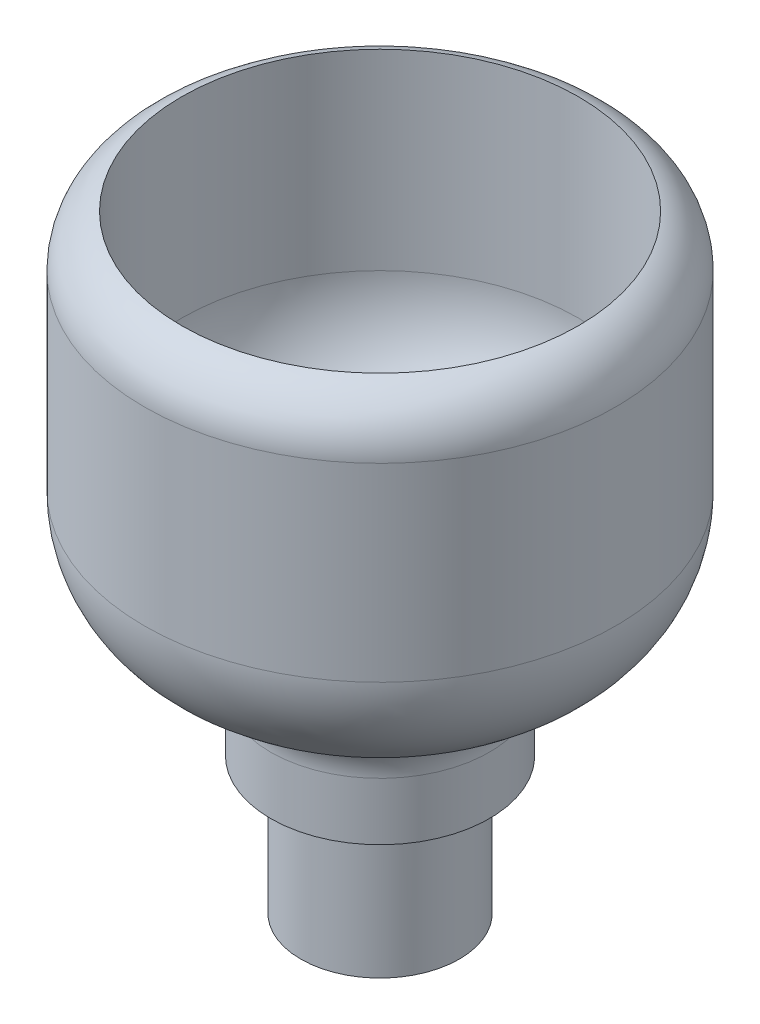
ISO-10303-21;
HEADER;
FILE_DESCRIPTION(('STEP AP214'),'2;1');
FILE_NAME('part.step','',(''),(''),'','','');
FILE_SCHEMA(('AUTOMOTIVE_DESIGN { 1 0 10303 214 1 1 1 1 }'));
ENDSEC;
DATA;
#1=APPLICATION_CONTEXT('core data for automotive mechanical design processes');
#2=APPLICATION_PROTOCOL_DEFINITION('international standard','automotive_design',2000,#1);
#3=PRODUCT_CONTEXT('',#1,'mechanical');
#4=PRODUCT('Part','Part','',(#3));
#5=PRODUCT_RELATED_PRODUCT_CATEGORY('part','',(#4));
#6=PRODUCT_DEFINITION_FORMATION('','',#4);
#7=PRODUCT_DEFINITION_CONTEXT('part definition',#1,'design');
#8=PRODUCT_DEFINITION('design','',#6,#7);
#9=PRODUCT_DEFINITION_SHAPE('','',#8);
#10=(LENGTH_UNIT() NAMED_UNIT(*) SI_UNIT(.MILLI.,.METRE.));
#11=(NAMED_UNIT(*) PLANE_ANGLE_UNIT() SI_UNIT($,.RADIAN.));
#12=(NAMED_UNIT(*) SI_UNIT($,.STERADIAN.) SOLID_ANGLE_UNIT());
#13=UNCERTAINTY_MEASURE_WITH_UNIT(LENGTH_MEASURE(1.E-05),#10,'distance_accuracy_value','');
#14=(GEOMETRIC_REPRESENTATION_CONTEXT(3) GLOBAL_UNCERTAINTY_ASSIGNED_CONTEXT((#13)) GLOBAL_UNIT_ASSIGNED_CONTEXT((#10,
#11,#12)) REPRESENTATION_CONTEXT('',''));
#15=CARTESIAN_POINT('',(0.,0.,0.));
#16=DIRECTION('',(0.,0.,1.));
#17=DIRECTION('',(1.,0.,0.));
#18=AXIS2_PLACEMENT_3D('',#15,#16,#17);
#19=CARTESIAN_POINT('',(2.80000000000001,5.76845965732955,0.));
#20=DIRECTION('',(0.,1.,0.));
#21=DIRECTION('',(0.,0.,1.));
#22=AXIS2_PLACEMENT_3D('',#19,#20,#21);
#23=PLANE('',#22);
#24=CARTESIAN_POINT('',(0.,5.76845965732956,0.));
#25=DIRECTION('',(0.,1.,0.));
#26=DIRECTION('',(0.,0.,1.));
#27=AXIS2_PLACEMENT_3D('',#24,#25,#26);
#28=CIRCLE('',#27,4.00000000000001);
#29=CARTESIAN_POINT('',(0.,5.76845965732956,4.00000000000001));
#30=VERTEX_POINT('',#29);
#31=EDGE_CURVE('E77',#30,#30,#28,.T.);
#32=ORIENTED_EDGE('',*,*,#31,.F.);
#33=EDGE_LOOP('',(#32));
#34=FACE_BOUND('',#33,.T.);
#35=CARTESIAN_POINT('',(0.,5.76845965732955,0.));
#36=DIRECTION('',(0.,1.,0.));
#37=DIRECTION('',(0.,0.,1.));
#38=AXIS2_PLACEMENT_3D('',#35,#36,#37);
#39=CIRCLE('',#38,2.9);
#40=CARTESIAN_POINT('',(0.,5.76845965732955,2.9));
#41=VERTEX_POINT('',#40);
#42=EDGE_CURVE('E10',#41,#41,#39,.F.);
#43=ORIENTED_EDGE('',*,*,#42,.F.);
#44=EDGE_LOOP('',(#43));
#45=FACE_BOUND('',#44,.T.);
#46=ADVANCED_FACE('F49',(#34,#45),#23,.F.);
#47=CARTESIAN_POINT('',(0.,15.9916837741224,0.));
#48=DIRECTION('',(0.,1.,0.));
#49=DIRECTION('',(0.,0.,1.));
#50=AXIS2_PLACEMENT_3D('',#47,#48,#49);
#51=DEGENERATE_TOROIDAL_SURFACE('',#50,2.80000000000001,4.45476445946329,.T.);
#52=CARTESIAN_POINT('',(0.,11.5369193146591,0.));
#53=DIRECTION('',(0.,1.,0.));
#54=DIRECTION('',(0.,0.,1.));
#55=AXIS2_PLACEMENT_3D('',#52,#53,#54);
#56=CIRCLE('',#55,2.80000000000001);
#57=CARTESIAN_POINT('',(0.,11.5369193146591,2.80000000000001));
#58=VERTEX_POINT('',#57);
#59=EDGE_CURVE('E73',#58,#58,#56,.T.);
#60=ORIENTED_EDGE('',*,*,#59,.F.);
#61=EDGE_LOOP('',(#60));
#62=FACE_BOUND('',#61,.T.);
#63=CARTESIAN_POINT('',(0.,15.9916837741224,0.));
#64=DIRECTION('',(0.,1.,0.));
#65=DIRECTION('',(0.,0.,1.));
#66=AXIS2_PLACEMENT_3D('',#63,#64,#65);
#67=CIRCLE('',#66,7.2547644594633);
#68=CARTESIAN_POINT('',(0.,15.9916837741224,7.2547644594633));
#69=VERTEX_POINT('',#68);
#70=EDGE_CURVE('E89',#69,#69,#67,.T.);
#71=ORIENTED_EDGE('',*,*,#70,.T.);
#72=EDGE_LOOP('',(#71));
#73=FACE_BOUND('',#72,.T.);
#74=ADVANCED_FACE('F120',(#62,#73),#51,.F.);
#75=CARTESIAN_POINT('',(0.,81.4290381730289,0.));
#76=DIRECTION('',(0.,1.,0.));
#77=DIRECTION('',(0.,0.,1.));
#78=AXIS2_PLACEMENT_3D('',#75,#76,#77);
#79=CYLINDRICAL_SURFACE('',#78,2.80000000000001);
#80=ORIENTED_EDGE('',*,*,#59,.T.);
#81=EDGE_LOOP('',(#80));
#82=FACE_BOUND('',#81,.T.);
#83=CARTESIAN_POINT('',(0.,0.768459657329554,0.));
#84=DIRECTION('',(0.,-1.,0.));
#85=DIRECTION('',(0.,0.,-1.));
#86=AXIS2_PLACEMENT_3D('',#83,#84,#85);
#87=CIRCLE('',#86,2.80000000000001);
#88=CARTESIAN_POINT('',(0.,0.768459657329554,-2.80000000000001));
#89=VERTEX_POINT('',#88);
#90=EDGE_CURVE('E97',#89,#89,#87,.T.);
#91=ORIENTED_EDGE('',*,*,#90,.T.);
#92=EDGE_LOOP('',(#91));
#93=FACE_BOUND('',#92,.T.);
#94=ADVANCED_FACE('F102',(#82,#93),#79,.F.);
#95=CARTESIAN_POINT('',(0.,81.4290381730289,0.));
#96=DIRECTION('',(0.,1.,0.));
#97=DIRECTION('',(0.,0.,1.));
#98=AXIS2_PLACEMENT_3D('',#95,#96,#97);
#99=CYLINDRICAL_SURFACE('',#98,4.00000000000001);
#100=CARTESIAN_POINT('',(0.,7.87083729987027,0.));
#101=DIRECTION('',(0.,1.,0.));
#102=DIRECTION('',(0.,0.,1.));
#103=AXIS2_PLACEMENT_3D('',#100,#101,#102);
#104=CIRCLE('',#103,4.00000000000001);
#105=CARTESIAN_POINT('',(0.,7.87083729987027,4.00000000000001));
#106=VERTEX_POINT('',#105);
#107=EDGE_CURVE('E57',#106,#106,#104,.F.);
#108=ORIENTED_EDGE('',*,*,#107,.T.);
#109=EDGE_LOOP('',(#108));
#110=FACE_BOUND('',#109,.T.);
#111=ORIENTED_EDGE('',*,*,#31,.T.);
#112=EDGE_LOOP('',(#111));
#113=FACE_BOUND('',#112,.T.);
#114=ADVANCED_FACE('F133',(#110,#113),#99,.T.);
#115=CARTESIAN_POINT('',(0.,14.1752426044835,0.));
#116=DIRECTION('',(0.,1.,0.));
#117=DIRECTION('',(0.,0.,1.));
#118=AXIS2_PLACEMENT_3D('',#115,#116,#117);
#119=DEGENERATE_TOROIDAL_SURFACE('',#118,4.00000000000001,4.614040084913,.T.);
#120=CARTESIAN_POINT('',(0.,9.77720775534845,0.));
#121=DIRECTION('',(0.,1.,0.));
#122=DIRECTION('',(0.,0.,1.));
#123=AXIS2_PLACEMENT_3D('',#120,#121,#122);
#124=CIRCLE('',#123,5.39522592112434);
#125=CARTESIAN_POINT('',(0.,9.77720775534845,5.39522592112434));
#126=VERTEX_POINT('',#125);
#127=EDGE_CURVE('E62',#126,#126,#124,.T.);
#128=ORIENTED_EDGE('',*,*,#127,.T.);
#129=EDGE_LOOP('',(#128));
#130=FACE_BOUND('',#129,.T.);
#131=CARTESIAN_POINT('',(0.,14.1752426044835,0.));
#132=DIRECTION('',(0.,1.,0.));
#133=DIRECTION('',(0.,0.,1.));
#134=AXIS2_PLACEMENT_3D('',#131,#132,#133);
#135=CIRCLE('',#134,8.61404008491301);
#136=CARTESIAN_POINT('',(0.,14.1752426044835,8.61404008491301));
#137=VERTEX_POINT('',#136);
#138=EDGE_CURVE('E81',#137,#137,#135,.T.);
#139=ORIENTED_EDGE('',*,*,#138,.F.);
#140=EDGE_LOOP('',(#139));
#141=FACE_BOUND('',#140,.T.);
#142=ADVANCED_FACE('F153',(#130,#141),#119,.T.);
#143=CARTESIAN_POINT('',(0.,81.4290381730289,0.));
#144=DIRECTION('',(0.,1.,0.));
#145=DIRECTION('',(0.,0.,1.));
#146=AXIS2_PLACEMENT_3D('',#143,#144,#145);
#147=CYLINDRICAL_SURFACE('',#146,8.61404008491301);
#148=CARTESIAN_POINT('',(0.,21.1080356819415,0.));
#149=DIRECTION('',(0.,1.,0.));
#150=DIRECTION('',(0.,0.,1.));
#151=AXIS2_PLACEMENT_3D('',#148,#149,#150);
#152=CIRCLE('',#151,8.61404008491301);
#153=CARTESIAN_POINT('',(0.,21.1080356819415,8.61404008491301));
#154=VERTEX_POINT('',#153);
#155=EDGE_CURVE('E67',#154,#154,#152,.F.);
#156=ORIENTED_EDGE('',*,*,#155,.T.);
#157=EDGE_LOOP('',(#156));
#158=FACE_BOUND('',#157,.T.);
#159=ORIENTED_EDGE('',*,*,#138,.T.);
#160=EDGE_LOOP('',(#159));
#161=FACE_BOUND('',#160,.T.);
#162=ADVANCED_FACE('F143',(#158,#161),#147,.T.);
#163=CARTESIAN_POINT('',(0.,81.4290381730289,0.));
#164=DIRECTION('',(0.,1.,0.));
#165=DIRECTION('',(0.,0.,1.));
#166=AXIS2_PLACEMENT_3D('',#163,#164,#165);
#167=CYLINDRICAL_SURFACE('',#166,7.2547644594633);
#168=ORIENTED_EDGE('',*,*,#70,.F.);
#169=EDGE_LOOP('',(#168));
#170=FACE_BOUND('',#169,.T.);
#171=CARTESIAN_POINT('',(0.,23.002625947898,0.));
#172=DIRECTION('',(0.,1.,0.));
#173=DIRECTION('',(0.,0.,1.));
#174=AXIS2_PLACEMENT_3D('',#171,#172,#173);
#175=CIRCLE('',#174,7.2547644594633);
#176=CARTESIAN_POINT('',(0.,23.002625947898,7.2547644594633));
#177=VERTEX_POINT('',#176);
#178=EDGE_CURVE('E85',#177,#177,#175,.T.);
#179=ORIENTED_EDGE('',*,*,#178,.T.);
#180=EDGE_LOOP('',(#179));
#181=FACE_BOUND('',#180,.T.);
#182=ADVANCED_FACE('F138',(#170,#181),#167,.F.);
#183=CARTESIAN_POINT('',(0.,21.1080356819415,0.));
#184=DIRECTION('',(0.,1.,0.));
#185=DIRECTION('',(0.,0.,1.));
#186=AXIS2_PLACEMENT_3D('',#183,#184,#185);
#187=TOROIDAL_SURFACE('',#186,6.61404008491301,2.);
#188=ORIENTED_EDGE('',*,*,#155,.F.);
#189=EDGE_LOOP('',(#188));
#190=FACE_BOUND('',#189,.T.);
#191=ORIENTED_EDGE('',*,*,#178,.F.);
#192=EDGE_LOOP('',(#191));
#193=FACE_BOUND('',#192,.T.);
#194=ADVANCED_FACE('F117',(#190,#193),#187,.T.);
#195=CARTESIAN_POINT('',(0.,7.87083729987027,0.));
#196=DIRECTION('',(0.,1.,0.));
#197=DIRECTION('',(0.,0.,1.));
#198=AXIS2_PLACEMENT_3D('',#195,#196,#197);
#199=TOROIDAL_SURFACE('',#198,6.00000000000001,2.);
#200=ORIENTED_EDGE('',*,*,#107,.F.);
#201=EDGE_LOOP('',(#200));
#202=FACE_BOUND('',#201,.T.);
#203=ORIENTED_EDGE('',*,*,#127,.F.);
#204=EDGE_LOOP('',(#203));
#205=FACE_BOUND('',#204,.T.);
#206=ADVANCED_FACE('F51',(#202,#205),#199,.F.);
#207=CARTESIAN_POINT('',(0.,0.768459657329554,0.));
#208=DIRECTION('',(0.,-1.,0.));
#209=DIRECTION('',(0.,0.,-1.));
#210=AXIS2_PLACEMENT_3D('',#207,#208,#209);
#211=PLANE('',#210);
#212=CARTESIAN_POINT('',(0.,0.768459657329554,0.));
#213=DIRECTION('',(0.,-1.,0.));
#214=DIRECTION('',(0.,0.,-1.));
#215=AXIS2_PLACEMENT_3D('',#212,#213,#214);
#216=CIRCLE('',#215,2.9);
#217=CARTESIAN_POINT('',(0.,0.768459657329554,-2.9));
#218=VERTEX_POINT('',#217);
#219=EDGE_CURVE('E93',#218,#218,#216,.T.);
#220=ORIENTED_EDGE('',*,*,#219,.T.);
#221=EDGE_LOOP('',(#220));
#222=FACE_BOUND('',#221,.T.);
#223=ORIENTED_EDGE('',*,*,#90,.F.);
#224=EDGE_LOOP('',(#223));
#225=FACE_BOUND('',#224,.T.);
#226=ADVANCED_FACE('F104',(#222,#225),#211,.T.);
#227=CARTESIAN_POINT('',(0.,0.768459657329554,0.));
#228=DIRECTION('',(0.,1.,0.));
#229=DIRECTION('',(0.,0.,1.));
#230=AXIS2_PLACEMENT_3D('',#227,#228,#229);
#231=CYLINDRICAL_SURFACE('',#230,2.9);
#232=ORIENTED_EDGE('',*,*,#219,.F.);
#233=EDGE_LOOP('',(#232));
#234=FACE_BOUND('',#233,.T.);
#235=ORIENTED_EDGE('',*,*,#42,.T.);
#236=EDGE_LOOP('',(#235));
#237=FACE_BOUND('',#236,.T.);
#238=ADVANCED_FACE('F106',(#234,#237),#231,.T.);
#239=CLOSED_SHELL('',(#46,#74,#94,#114,#142,#162,#182,#194,#206,#226,#238));
#240=MANIFOLD_SOLID_BREP('B2',#239);
#241=ADVANCED_BREP_SHAPE_REPRESENTATION('',(#18,#240),#14);
#242=SHAPE_DEFINITION_REPRESENTATION(#9,#241);
ENDSEC;
END-ISO-10303-21;
